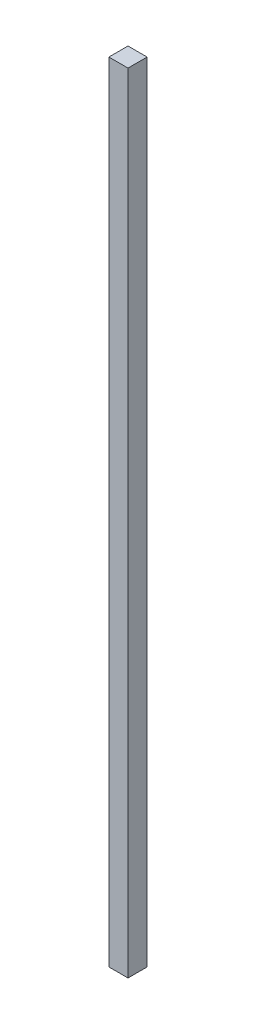
ISO-10303-21;
HEADER;
FILE_DESCRIPTION(('STEP AP214'),'2;1');
FILE_NAME('part.step','',(''),(''),'','','');
FILE_SCHEMA(('AUTOMOTIVE_DESIGN { 1 0 10303 214 1 1 1 1 }'));
ENDSEC;
DATA;
#1=APPLICATION_CONTEXT('core data for automotive mechanical design processes');
#2=APPLICATION_PROTOCOL_DEFINITION('international standard','automotive_design',2000,#1);
#3=PRODUCT_CONTEXT('',#1,'mechanical');
#4=PRODUCT('Part','Part','',(#3));
#5=PRODUCT_RELATED_PRODUCT_CATEGORY('part','',(#4));
#6=PRODUCT_DEFINITION_FORMATION('','',#4);
#7=PRODUCT_DEFINITION_CONTEXT('part definition',#1,'design');
#8=PRODUCT_DEFINITION('design','',#6,#7);
#9=PRODUCT_DEFINITION_SHAPE('','',#8);
#10=(LENGTH_UNIT() NAMED_UNIT(*) SI_UNIT(.MILLI.,.METRE.));
#11=(NAMED_UNIT(*) PLANE_ANGLE_UNIT() SI_UNIT($,.RADIAN.));
#12=(NAMED_UNIT(*) SI_UNIT($,.STERADIAN.) SOLID_ANGLE_UNIT());
#13=UNCERTAINTY_MEASURE_WITH_UNIT(LENGTH_MEASURE(1.E-05),#10,'distance_accuracy_value','');
#14=(GEOMETRIC_REPRESENTATION_CONTEXT(3) GLOBAL_UNCERTAINTY_ASSIGNED_CONTEXT((#13)) GLOBAL_UNIT_ASSIGNED_CONTEXT((#10,
#11,#12)) REPRESENTATION_CONTEXT('',''));
#15=CARTESIAN_POINT('',(0.,0.,0.));
#16=DIRECTION('',(0.,0.,1.));
#17=DIRECTION('',(1.,0.,0.));
#18=AXIS2_PLACEMENT_3D('',#15,#16,#17);
#19=CARTESIAN_POINT('',(612.5,250.,-700.));
#20=DIRECTION('',(-1.,0.,0.));
#21=DIRECTION('',(0.,0.,1.));
#22=AXIS2_PLACEMENT_3D('',#19,#20,#21);
#23=PLANE('',#22);
#24=DIRECTION('',(0.,-1.,0.));
#25=VECTOR('',#24,1.);
#26=CARTESIAN_POINT('',(612.5,250.,-660.));
#27=LINE('',#26,#25);
#28=CARTESIAN_POINT('',(612.5,1900.,-660.));
#29=VERTEX_POINT('',#28);
#30=CARTESIAN_POINT('',(612.5,250.,-660.));
#31=VERTEX_POINT('',#30);
#32=EDGE_CURVE('E103',#29,#31,#27,.T.);
#33=ORIENTED_EDGE('',*,*,#32,.F.);
#34=DIRECTION('',(0.,0.,1.));
#35=VECTOR('',#34,1.);
#36=CARTESIAN_POINT('',(612.5,1900.,-700.));
#37=LINE('',#36,#35);
#38=CARTESIAN_POINT('',(612.5,1900.,-700.));
#39=VERTEX_POINT('',#38);
#40=EDGE_CURVE('E11',#39,#29,#37,.T.);
#41=ORIENTED_EDGE('',*,*,#40,.F.);
#42=DIRECTION('',(0.,-1.,0.));
#43=VECTOR('',#42,1.);
#44=CARTESIAN_POINT('',(612.5,250.,-700.));
#45=LINE('',#44,#43);
#46=CARTESIAN_POINT('',(612.5,250.,-700.));
#47=VERTEX_POINT('',#46);
#48=EDGE_CURVE('E97',#39,#47,#45,.T.);
#49=ORIENTED_EDGE('',*,*,#48,.T.);
#50=DIRECTION('',(0.,0.,1.));
#51=VECTOR('',#50,1.);
#52=CARTESIAN_POINT('',(612.5,250.,-700.));
#53=LINE('',#52,#51);
#54=EDGE_CURVE('E42',#47,#31,#53,.T.);
#55=ORIENTED_EDGE('',*,*,#54,.T.);
#56=EDGE_LOOP('',(#33,#41,#49,#55));
#57=FACE_BOUND('',#56,.T.);
#58=ADVANCED_FACE('F39',(#57),#23,.T.);
#59=CARTESIAN_POINT('',(612.5,1900.,-700.));
#60=DIRECTION('',(0.,1.,0.));
#61=DIRECTION('',(0.,0.,1.));
#62=AXIS2_PLACEMENT_3D('',#59,#60,#61);
#63=PLANE('',#62);
#64=DIRECTION('',(-1.,0.,0.));
#65=VECTOR('',#64,1.);
#66=CARTESIAN_POINT('',(612.5,1900.,-660.));
#67=LINE('',#66,#65);
#68=CARTESIAN_POINT('',(652.5,1900.,-660.));
#69=VERTEX_POINT('',#68);
#70=EDGE_CURVE('E99',#69,#29,#67,.T.);
#71=ORIENTED_EDGE('',*,*,#70,.F.);
#72=DIRECTION('',(0.,0.,1.));
#73=VECTOR('',#72,1.);
#74=CARTESIAN_POINT('',(652.5,1900.,-700.));
#75=LINE('',#74,#73);
#76=CARTESIAN_POINT('',(652.5,1900.,-700.));
#77=VERTEX_POINT('',#76);
#78=EDGE_CURVE('E48',#77,#69,#75,.T.);
#79=ORIENTED_EDGE('',*,*,#78,.F.);
#80=DIRECTION('',(-1.,0.,0.));
#81=VECTOR('',#80,1.);
#82=CARTESIAN_POINT('',(612.5,1900.,-700.));
#83=LINE('',#82,#81);
#84=EDGE_CURVE('E94',#77,#39,#83,.T.);
#85=ORIENTED_EDGE('',*,*,#84,.T.);
#86=ORIENTED_EDGE('',*,*,#40,.T.);
#87=EDGE_LOOP('',(#71,#79,#85,#86));
#88=FACE_BOUND('',#87,.T.);
#89=ADVANCED_FACE('F113',(#88),#63,.T.);
#90=CARTESIAN_POINT('',(652.5,250.,-700.));
#91=DIRECTION('',(1.,0.,0.));
#92=DIRECTION('',(0.,0.,-1.));
#93=AXIS2_PLACEMENT_3D('',#90,#91,#92);
#94=PLANE('',#93);
#95=DIRECTION('',(0.,1.,0.));
#96=VECTOR('',#95,1.);
#97=CARTESIAN_POINT('',(652.5,250.,-660.));
#98=LINE('',#97,#96);
#99=CARTESIAN_POINT('',(652.5,250.,-660.));
#100=VERTEX_POINT('',#99);
#101=EDGE_CURVE('E89',#100,#69,#98,.T.);
#102=ORIENTED_EDGE('',*,*,#101,.F.);
#103=DIRECTION('',(0.,0.,1.));
#104=VECTOR('',#103,1.);
#105=CARTESIAN_POINT('',(652.5,250.,-700.));
#106=LINE('',#105,#104);
#107=CARTESIAN_POINT('',(652.5,250.,-700.));
#108=VERTEX_POINT('',#107);
#109=EDGE_CURVE('E84',#108,#100,#106,.T.);
#110=ORIENTED_EDGE('',*,*,#109,.F.);
#111=DIRECTION('',(0.,1.,0.));
#112=VECTOR('',#111,1.);
#113=CARTESIAN_POINT('',(652.5,250.,-700.));
#114=LINE('',#113,#112);
#115=EDGE_CURVE('E87',#108,#77,#114,.T.);
#116=ORIENTED_EDGE('',*,*,#115,.T.);
#117=ORIENTED_EDGE('',*,*,#78,.T.);
#118=EDGE_LOOP('',(#102,#110,#116,#117));
#119=FACE_BOUND('',#118,.T.);
#120=ADVANCED_FACE('F86',(#119),#94,.T.);
#121=CARTESIAN_POINT('',(612.5,250.,-700.));
#122=DIRECTION('',(0.,-1.,0.));
#123=DIRECTION('',(0.,0.,-1.));
#124=AXIS2_PLACEMENT_3D('',#121,#122,#123);
#125=PLANE('',#124);
#126=DIRECTION('',(1.,0.,0.));
#127=VECTOR('',#126,1.);
#128=CARTESIAN_POINT('',(612.5,250.,-660.));
#129=LINE('',#128,#127);
#130=EDGE_CURVE('E106',#31,#100,#129,.T.);
#131=ORIENTED_EDGE('',*,*,#130,.F.);
#132=ORIENTED_EDGE('',*,*,#54,.F.);
#133=DIRECTION('',(1.,0.,0.));
#134=VECTOR('',#133,1.);
#135=CARTESIAN_POINT('',(612.5,250.,-700.));
#136=LINE('',#135,#134);
#137=EDGE_CURVE('E93',#47,#108,#136,.T.);
#138=ORIENTED_EDGE('',*,*,#137,.T.);
#139=ORIENTED_EDGE('',*,*,#109,.T.);
#140=EDGE_LOOP('',(#131,#132,#138,#139));
#141=FACE_BOUND('',#140,.T.);
#142=ADVANCED_FACE('F96',(#141),#125,.T.);
#143=CARTESIAN_POINT('',(0.,0.,-700.));
#144=DIRECTION('',(0.,0.,-1.));
#145=DIRECTION('',(-1.,0.,0.));
#146=AXIS2_PLACEMENT_3D('',#143,#144,#145);
#147=PLANE('',#146);
#148=ORIENTED_EDGE('',*,*,#48,.F.);
#149=ORIENTED_EDGE('',*,*,#84,.F.);
#150=ORIENTED_EDGE('',*,*,#115,.F.);
#151=ORIENTED_EDGE('',*,*,#137,.F.);
#152=EDGE_LOOP('',(#148,#149,#150,#151));
#153=FACE_BOUND('',#152,.T.);
#154=ADVANCED_FACE('F92',(#153),#147,.T.);
#155=CARTESIAN_POINT('',(0.,0.,-660.));
#156=DIRECTION('',(0.,0.,-1.));
#157=DIRECTION('',(-1.,0.,0.));
#158=AXIS2_PLACEMENT_3D('',#155,#156,#157);
#159=PLANE('',#158);
#160=ORIENTED_EDGE('',*,*,#32,.T.);
#161=ORIENTED_EDGE('',*,*,#130,.T.);
#162=ORIENTED_EDGE('',*,*,#101,.T.);
#163=ORIENTED_EDGE('',*,*,#70,.T.);
#164=EDGE_LOOP('',(#160,#161,#162,#163));
#165=FACE_BOUND('',#164,.T.);
#166=ADVANCED_FACE('F112',(#165),#159,.F.);
#167=CLOSED_SHELL('',(#58,#89,#120,#142,#154,#166));
#168=MANIFOLD_SOLID_BREP('B2',#167);
#169=ADVANCED_BREP_SHAPE_REPRESENTATION('',(#18,#168),#14);
#170=SHAPE_DEFINITION_REPRESENTATION(#9,#169);
ENDSEC;
END-ISO-10303-21;
